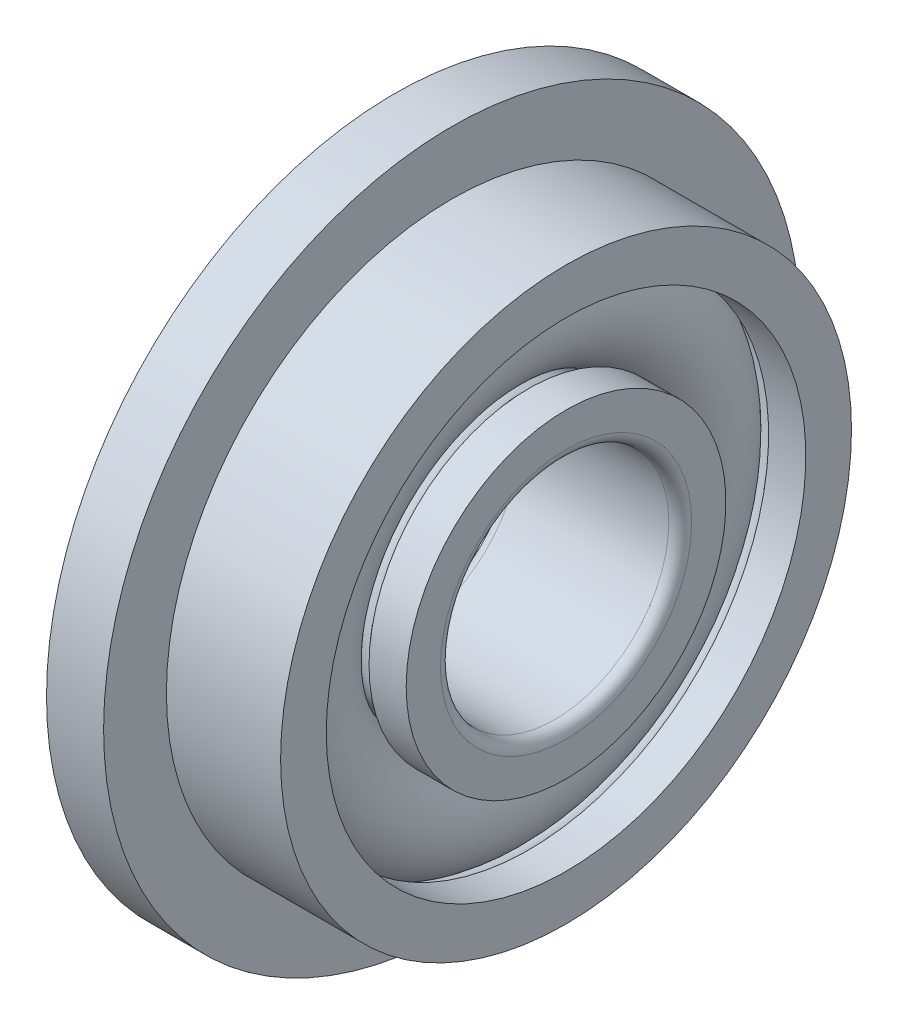
ISO-10303-21;
HEADER;
FILE_DESCRIPTION(('STEP AP214'),'2;1');
FILE_NAME('part.step','',(''),(''),'','','');
FILE_SCHEMA(('AUTOMOTIVE_DESIGN { 1 0 10303 214 1 1 1 1 }'));
ENDSEC;
DATA;
#1=APPLICATION_CONTEXT('core data for automotive mechanical design processes');
#2=APPLICATION_PROTOCOL_DEFINITION('international standard','automotive_design',2000,#1);
#3=PRODUCT_CONTEXT('',#1,'mechanical');
#4=PRODUCT('Part','Part','',(#3));
#5=PRODUCT_RELATED_PRODUCT_CATEGORY('part','',(#4));
#6=PRODUCT_DEFINITION_FORMATION('','',#4);
#7=PRODUCT_DEFINITION_CONTEXT('part definition',#1,'design');
#8=PRODUCT_DEFINITION('design','',#6,#7);
#9=PRODUCT_DEFINITION_SHAPE('','',#8);
#10=(LENGTH_UNIT() NAMED_UNIT(*) SI_UNIT(.MILLI.,.METRE.));
#11=(NAMED_UNIT(*) PLANE_ANGLE_UNIT() SI_UNIT($,.RADIAN.));
#12=(NAMED_UNIT(*) SI_UNIT($,.STERADIAN.) SOLID_ANGLE_UNIT());
#13=UNCERTAINTY_MEASURE_WITH_UNIT(LENGTH_MEASURE(1.E-05),#10,'distance_accuracy_value','');
#14=(GEOMETRIC_REPRESENTATION_CONTEXT(3) GLOBAL_UNCERTAINTY_ASSIGNED_CONTEXT((#13)) GLOBAL_UNIT_ASSIGNED_CONTEXT((#10,
#11,#12)) REPRESENTATION_CONTEXT('',''));
#15=CARTESIAN_POINT('',(0.,0.,0.));
#16=DIRECTION('',(0.,0.,1.));
#17=DIRECTION('',(1.,0.,0.));
#18=AXIS2_PLACEMENT_3D('',#15,#16,#17);
#19=CARTESIAN_POINT('',(0.75,0.,0.));
#20=DIRECTION('',(-1.,0.,0.));
#21=DIRECTION('',(0.,0.,1.));
#22=AXIS2_PLACEMENT_3D('',#19,#20,#21);
#23=TOROIDAL_SURFACE('',#22,1.75,0.5);
#24=CARTESIAN_POINT('',(0.75,0.,2.25));
#25=VERTEX_POINT('',#24);
#26=VERTEX_LOOP('',#25);
#27=FACE_BOUND('',#26,.T.);
#28=ADVANCED_FACE('F50',(#27),#23,.T.);
#29=CLOSED_SHELL('',(#28));
#30=MANIFOLD_SOLID_BREP('B2',#29);
#31=CARTESIAN_POINT('',(1.5,1.4,0.));
#32=DIRECTION('',(-1.,0.,0.));
#33=DIRECTION('',(0.,0.,1.));
#34=AXIS2_PLACEMENT_3D('',#31,#32,#33);
#35=PLANE('',#34);
#36=CARTESIAN_POINT('',(1.5,0.,0.));
#37=DIRECTION('',(-1.,0.,0.));
#38=DIRECTION('',(0.,0.,1.));
#39=AXIS2_PLACEMENT_3D('',#36,#37,#38);
#40=CIRCLE('',#39,1.1);
#41=CARTESIAN_POINT('',(1.5,0.,1.1));
#42=VERTEX_POINT('',#41);
#43=EDGE_CURVE('E85',#42,#42,#40,.T.);
#44=ORIENTED_EDGE('',*,*,#43,.T.);
#45=EDGE_LOOP('',(#44));
#46=FACE_BOUND('',#45,.T.);
#47=CARTESIAN_POINT('',(1.5,0.,0.));
#48=DIRECTION('',(-1.,0.,0.));
#49=DIRECTION('',(0.,0.,1.));
#50=AXIS2_PLACEMENT_3D('',#47,#48,#49);
#51=CIRCLE('',#50,1.4);
#52=CARTESIAN_POINT('',(1.5,0.,1.4));
#53=VERTEX_POINT('',#52);
#54=EDGE_CURVE('E90',#53,#53,#51,.T.);
#55=ORIENTED_EDGE('',*,*,#54,.F.);
#56=EDGE_LOOP('',(#55));
#57=FACE_BOUND('',#56,.T.);
#58=ADVANCED_FACE('F70',(#46,#57),#35,.F.);
#59=CARTESIAN_POINT('',(0.,0.,0.));
#60=DIRECTION('',(-1.,0.,0.));
#61=DIRECTION('',(0.,0.,1.));
#62=AXIS2_PLACEMENT_3D('',#59,#60,#61);
#63=CYLINDRICAL_SURFACE('',#62,1.4);
#64=CARTESIAN_POINT('',(1.17426406871193,0.,0.));
#65=DIRECTION('',(-1.,0.,0.));
#66=DIRECTION('',(0.,0.,1.));
#67=AXIS2_PLACEMENT_3D('',#64,#65,#66);
#68=CIRCLE('',#67,1.4);
#69=CARTESIAN_POINT('',(1.17426406871193,0.,1.4));
#70=VERTEX_POINT('',#69);
#71=EDGE_CURVE('E93',#70,#70,#68,.T.);
#72=ORIENTED_EDGE('',*,*,#71,.F.);
#73=EDGE_LOOP('',(#72));
#74=FACE_BOUND('',#73,.T.);
#75=ORIENTED_EDGE('',*,*,#54,.T.);
#76=EDGE_LOOP('',(#75));
#77=FACE_BOUND('',#76,.T.);
#78=ADVANCED_FACE('F114',(#74,#77),#63,.T.);
#79=CARTESIAN_POINT('',(0.75,0.,0.));
#80=DIRECTION('',(-1.,0.,0.));
#81=DIRECTION('',(0.,0.,1.));
#82=AXIS2_PLACEMENT_3D('',#79,#80,#81);
#83=TOROIDAL_SURFACE('',#82,1.75,0.55);
#84=CARTESIAN_POINT('',(0.325735931288072,0.,0.));
#85=DIRECTION('',(-1.,0.,0.));
#86=DIRECTION('',(0.,0.,1.));
#87=AXIS2_PLACEMENT_3D('',#84,#85,#86);
#88=CIRCLE('',#87,1.4);
#89=CARTESIAN_POINT('',(0.325735931288072,0.,1.4));
#90=VERTEX_POINT('',#89);
#91=EDGE_CURVE('E96',#90,#90,#88,.T.);
#92=ORIENTED_EDGE('',*,*,#91,.F.);
#93=EDGE_LOOP('',(#92));
#94=FACE_BOUND('',#93,.T.);
#95=ORIENTED_EDGE('',*,*,#71,.T.);
#96=EDGE_LOOP('',(#95));
#97=FACE_BOUND('',#96,.T.);
#98=ADVANCED_FACE('F108',(#94,#97),#83,.F.);
#99=CARTESIAN_POINT('',(0.,0.,0.));
#100=DIRECTION('',(-1.,0.,0.));
#101=DIRECTION('',(0.,0.,1.));
#102=AXIS2_PLACEMENT_3D('',#99,#100,#101);
#103=CYLINDRICAL_SURFACE('',#102,1.4);
#104=CARTESIAN_POINT('',(0.,0.,0.));
#105=DIRECTION('',(-1.,0.,0.));
#106=DIRECTION('',(0.,0.,1.));
#107=AXIS2_PLACEMENT_3D('',#104,#105,#106);
#108=CIRCLE('',#107,1.4);
#109=CARTESIAN_POINT('',(0.,0.,1.4));
#110=VERTEX_POINT('',#109);
#111=EDGE_CURVE('E99',#110,#110,#108,.T.);
#112=ORIENTED_EDGE('',*,*,#111,.F.);
#113=EDGE_LOOP('',(#112));
#114=FACE_BOUND('',#113,.T.);
#115=ORIENTED_EDGE('',*,*,#91,.T.);
#116=EDGE_LOOP('',(#115));
#117=FACE_BOUND('',#116,.T.);
#118=ADVANCED_FACE('F105',(#114,#117),#103,.T.);
#119=CARTESIAN_POINT('',(0.,1.4,0.));
#120=DIRECTION('',(1.,0.,0.));
#121=DIRECTION('',(0.,0.,-1.));
#122=AXIS2_PLACEMENT_3D('',#119,#120,#121);
#123=PLANE('',#122);
#124=CARTESIAN_POINT('',(0.,0.,0.));
#125=DIRECTION('',(1.,0.,0.));
#126=DIRECTION('',(0.,0.,-1.));
#127=AXIS2_PLACEMENT_3D('',#124,#125,#126);
#128=CIRCLE('',#127,1.1);
#129=CARTESIAN_POINT('',(0.,0.,-1.1));
#130=VERTEX_POINT('',#129);
#131=EDGE_CURVE('E49',#130,#130,#128,.T.);
#132=ORIENTED_EDGE('',*,*,#131,.T.);
#133=EDGE_LOOP('',(#132));
#134=FACE_BOUND('',#133,.T.);
#135=ORIENTED_EDGE('',*,*,#111,.T.);
#136=EDGE_LOOP('',(#135));
#137=FACE_BOUND('',#136,.T.);
#138=ADVANCED_FACE('F103',(#134,#137),#123,.F.);
#139=CARTESIAN_POINT('',(0.,0.,0.));
#140=DIRECTION('',(-1.,0.,0.));
#141=DIRECTION('',(0.,0.,1.));
#142=AXIS2_PLACEMENT_3D('',#139,#140,#141);
#143=CYLINDRICAL_SURFACE('',#142,1.);
#144=CARTESIAN_POINT('',(1.4,0.,0.));
#145=DIRECTION('',(-1.,0.,0.));
#146=DIRECTION('',(0.,0.,1.));
#147=AXIS2_PLACEMENT_3D('',#144,#145,#146);
#148=CIRCLE('',#147,1.);
#149=CARTESIAN_POINT('',(1.4,0.,1.));
#150=VERTEX_POINT('',#149);
#151=EDGE_CURVE('E77',#150,#150,#148,.F.);
#152=ORIENTED_EDGE('',*,*,#151,.T.);
#153=EDGE_LOOP('',(#152));
#154=FACE_BOUND('',#153,.T.);
#155=CARTESIAN_POINT('',(0.1,0.,0.));
#156=DIRECTION('',(1.,0.,0.));
#157=DIRECTION('',(0.,0.,-1.));
#158=AXIS2_PLACEMENT_3D('',#155,#156,#157);
#159=CIRCLE('',#158,1.);
#160=CARTESIAN_POINT('',(0.1,0.,-1.));
#161=VERTEX_POINT('',#160);
#162=EDGE_CURVE('E81',#161,#161,#159,.F.);
#163=ORIENTED_EDGE('',*,*,#162,.T.);
#164=EDGE_LOOP('',(#163));
#165=FACE_BOUND('',#164,.T.);
#166=ADVANCED_FACE('F131',(#154,#165),#143,.F.);
#167=CARTESIAN_POINT('',(1.4,0.,0.));
#168=DIRECTION('',(-1.,0.,0.));
#169=DIRECTION('',(0.,0.,1.));
#170=AXIS2_PLACEMENT_3D('',#167,#168,#169);
#171=TOROIDAL_SURFACE('',#170,1.1,0.1);
#172=ORIENTED_EDGE('',*,*,#151,.F.);
#173=EDGE_LOOP('',(#172));
#174=FACE_BOUND('',#173,.T.);
#175=ORIENTED_EDGE('',*,*,#43,.F.);
#176=EDGE_LOOP('',(#175));
#177=FACE_BOUND('',#176,.T.);
#178=ADVANCED_FACE('F129',(#174,#177),#171,.T.);
#179=CARTESIAN_POINT('',(0.1,0.,0.));
#180=DIRECTION('',(1.,0.,0.));
#181=DIRECTION('',(0.,0.,-1.));
#182=AXIS2_PLACEMENT_3D('',#179,#180,#181);
#183=TOROIDAL_SURFACE('',#182,1.1,0.1);
#184=ORIENTED_EDGE('',*,*,#131,.F.);
#185=EDGE_LOOP('',(#184));
#186=FACE_BOUND('',#185,.T.);
#187=ORIENTED_EDGE('',*,*,#162,.F.);
#188=EDGE_LOOP('',(#187));
#189=FACE_BOUND('',#188,.T.);
#190=ADVANCED_FACE('F72',(#186,#189),#183,.T.);
#191=CLOSED_SHELL('',(#58,#78,#98,#118,#138,#166,#178,#190));
#192=MANIFOLD_SOLID_BREP('B6',#191);
#193=CARTESIAN_POINT('',(0.,2.5,0.));
#194=DIRECTION('',(1.,0.,0.));
#195=DIRECTION('',(0.,0.,-1.));
#196=AXIS2_PLACEMENT_3D('',#193,#194,#195);
#197=PLANE('',#196);
#198=CARTESIAN_POINT('',(0.,0.,0.));
#199=DIRECTION('',(-1.,0.,0.));
#200=DIRECTION('',(0.,0.,1.));
#201=AXIS2_PLACEMENT_3D('',#198,#199,#200);
#202=CIRCLE('',#201,2.1);
#203=CARTESIAN_POINT('',(0.,0.,2.1));
#204=VERTEX_POINT('',#203);
#205=EDGE_CURVE('E69',#204,#204,#202,.T.);
#206=ORIENTED_EDGE('',*,*,#205,.F.);
#207=EDGE_LOOP('',(#206));
#208=FACE_BOUND('',#207,.T.);
#209=CARTESIAN_POINT('',(0.,0.,0.));
#210=DIRECTION('',(-1.,0.,0.));
#211=DIRECTION('',(0.,0.,1.));
#212=AXIS2_PLACEMENT_3D('',#209,#210,#211);
#213=CIRCLE('',#212,3.05);
#214=CARTESIAN_POINT('',(0.,0.,3.05));
#215=VERTEX_POINT('',#214);
#216=EDGE_CURVE('E227',#215,#215,#213,.T.);
#217=ORIENTED_EDGE('',*,*,#216,.T.);
#218=EDGE_LOOP('',(#217));
#219=FACE_BOUND('',#218,.T.);
#220=ADVANCED_FACE('F192',(#208,#219),#197,.F.);
#221=CARTESIAN_POINT('',(0.,0.,0.));
#222=DIRECTION('',(-1.,0.,0.));
#223=DIRECTION('',(0.,0.,1.));
#224=AXIS2_PLACEMENT_3D('',#221,#222,#223);
#225=CYLINDRICAL_SURFACE('',#224,2.1);
#226=CARTESIAN_POINT('',(0.325735931288072,0.,0.));
#227=DIRECTION('',(-1.,0.,0.));
#228=DIRECTION('',(0.,0.,1.));
#229=AXIS2_PLACEMENT_3D('',#226,#227,#228);
#230=CIRCLE('',#229,2.1);
#231=CARTESIAN_POINT('',(0.325735931288072,0.,2.1));
#232=VERTEX_POINT('',#231);
#233=EDGE_CURVE('E199',#232,#232,#230,.T.);
#234=ORIENTED_EDGE('',*,*,#233,.F.);
#235=EDGE_LOOP('',(#234));
#236=FACE_BOUND('',#235,.T.);
#237=ORIENTED_EDGE('',*,*,#205,.T.);
#238=EDGE_LOOP('',(#237));
#239=FACE_BOUND('',#238,.T.);
#240=ADVANCED_FACE('F265',(#236,#239),#225,.F.);
#241=CARTESIAN_POINT('',(0.75,0.,0.));
#242=DIRECTION('',(-1.,0.,0.));
#243=DIRECTION('',(0.,0.,1.));
#244=AXIS2_PLACEMENT_3D('',#241,#242,#243);
#245=TOROIDAL_SURFACE('',#244,1.75,0.55);
#246=CARTESIAN_POINT('',(1.17426406871193,0.,0.));
#247=DIRECTION('',(-1.,0.,0.));
#248=DIRECTION('',(0.,0.,1.));
#249=AXIS2_PLACEMENT_3D('',#246,#247,#248);
#250=CIRCLE('',#249,2.1);
#251=CARTESIAN_POINT('',(1.17426406871193,0.,2.1));
#252=VERTEX_POINT('',#251);
#253=EDGE_CURVE('E204',#252,#252,#250,.T.);
#254=ORIENTED_EDGE('',*,*,#253,.F.);
#255=EDGE_LOOP('',(#254));
#256=FACE_BOUND('',#255,.T.);
#257=ORIENTED_EDGE('',*,*,#233,.T.);
#258=EDGE_LOOP('',(#257));
#259=FACE_BOUND('',#258,.T.);
#260=ADVANCED_FACE('F260',(#256,#259),#245,.F.);
#261=CARTESIAN_POINT('',(0.,0.,0.));
#262=DIRECTION('',(-1.,0.,0.));
#263=DIRECTION('',(0.,0.,1.));
#264=AXIS2_PLACEMENT_3D('',#261,#262,#263);
#265=CYLINDRICAL_SURFACE('',#264,2.1);
#266=CARTESIAN_POINT('',(1.5,0.,0.));
#267=DIRECTION('',(-1.,0.,0.));
#268=DIRECTION('',(0.,0.,1.));
#269=AXIS2_PLACEMENT_3D('',#266,#267,#268);
#270=CIRCLE('',#269,2.1);
#271=CARTESIAN_POINT('',(1.5,0.,2.1));
#272=VERTEX_POINT('',#271);
#273=EDGE_CURVE('E209',#272,#272,#270,.T.);
#274=ORIENTED_EDGE('',*,*,#273,.F.);
#275=EDGE_LOOP('',(#274));
#276=FACE_BOUND('',#275,.T.);
#277=ORIENTED_EDGE('',*,*,#253,.T.);
#278=EDGE_LOOP('',(#277));
#279=FACE_BOUND('',#278,.T.);
#280=ADVANCED_FACE('F254',(#276,#279),#265,.F.);
#281=CARTESIAN_POINT('',(1.5,2.5,0.));
#282=DIRECTION('',(-1.,0.,0.));
#283=DIRECTION('',(0.,0.,1.));
#284=AXIS2_PLACEMENT_3D('',#281,#282,#283);
#285=PLANE('',#284);
#286=CARTESIAN_POINT('',(1.5,0.,0.));
#287=DIRECTION('',(-1.,0.,0.));
#288=DIRECTION('',(0.,0.,1.));
#289=AXIS2_PLACEMENT_3D('',#286,#287,#288);
#290=CIRCLE('',#289,2.5);
#291=CARTESIAN_POINT('',(1.5,0.,2.5));
#292=VERTEX_POINT('',#291);
#293=EDGE_CURVE('E215',#292,#292,#290,.T.);
#294=ORIENTED_EDGE('',*,*,#293,.F.);
#295=EDGE_LOOP('',(#294));
#296=FACE_BOUND('',#295,.T.);
#297=ORIENTED_EDGE('',*,*,#273,.T.);
#298=EDGE_LOOP('',(#297));
#299=FACE_BOUND('',#298,.T.);
#300=ADVANCED_FACE('F248',(#296,#299),#285,.F.);
#301=CARTESIAN_POINT('',(0.,0.,0.));
#302=DIRECTION('',(-1.,0.,0.));
#303=DIRECTION('',(0.,0.,1.));
#304=AXIS2_PLACEMENT_3D('',#301,#302,#303);
#305=CYLINDRICAL_SURFACE('',#304,2.5);
#306=CARTESIAN_POINT('',(0.5,0.,0.));
#307=DIRECTION('',(-1.,0.,0.));
#308=DIRECTION('',(0.,0.,1.));
#309=AXIS2_PLACEMENT_3D('',#306,#307,#308);
#310=CIRCLE('',#309,2.5);
#311=CARTESIAN_POINT('',(0.5,0.,2.5));
#312=VERTEX_POINT('',#311);
#313=EDGE_CURVE('E219',#312,#312,#310,.T.);
#314=ORIENTED_EDGE('',*,*,#313,.F.);
#315=EDGE_LOOP('',(#314));
#316=FACE_BOUND('',#315,.T.);
#317=ORIENTED_EDGE('',*,*,#293,.T.);
#318=EDGE_LOOP('',(#317));
#319=FACE_BOUND('',#318,.T.);
#320=ADVANCED_FACE('F242',(#316,#319),#305,.T.);
#321=CARTESIAN_POINT('',(0.5,3.05,0.));
#322=DIRECTION('',(-1.,0.,0.));
#323=DIRECTION('',(0.,0.,1.));
#324=AXIS2_PLACEMENT_3D('',#321,#322,#323);
#325=PLANE('',#324);
#326=CARTESIAN_POINT('',(0.5,0.,0.));
#327=DIRECTION('',(-1.,0.,0.));
#328=DIRECTION('',(0.,0.,1.));
#329=AXIS2_PLACEMENT_3D('',#326,#327,#328);
#330=CIRCLE('',#329,3.05);
#331=CARTESIAN_POINT('',(0.5,0.,3.05));
#332=VERTEX_POINT('',#331);
#333=EDGE_CURVE('E223',#332,#332,#330,.T.);
#334=ORIENTED_EDGE('',*,*,#333,.F.);
#335=EDGE_LOOP('',(#334));
#336=FACE_BOUND('',#335,.T.);
#337=ORIENTED_EDGE('',*,*,#313,.T.);
#338=EDGE_LOOP('',(#337));
#339=FACE_BOUND('',#338,.T.);
#340=ADVANCED_FACE('F236',(#336,#339),#325,.F.);
#341=CARTESIAN_POINT('',(0.,0.,0.));
#342=DIRECTION('',(-1.,0.,0.));
#343=DIRECTION('',(0.,0.,1.));
#344=AXIS2_PLACEMENT_3D('',#341,#342,#343);
#345=CYLINDRICAL_SURFACE('',#344,3.05);
#346=ORIENTED_EDGE('',*,*,#216,.F.);
#347=EDGE_LOOP('',(#346));
#348=FACE_BOUND('',#347,.T.);
#349=ORIENTED_EDGE('',*,*,#333,.T.);
#350=EDGE_LOOP('',(#349));
#351=FACE_BOUND('',#350,.T.);
#352=ADVANCED_FACE('F233',(#348,#351),#345,.T.);
#353=CLOSED_SHELL('',(#220,#240,#260,#280,#300,#320,#340,#352));
#354=MANIFOLD_SOLID_BREP('B44',#353);
#355=ADVANCED_BREP_SHAPE_REPRESENTATION('',(#18,#30,#192,#354),#14);
#356=SHAPE_DEFINITION_REPRESENTATION(#9,#355);
ENDSEC;
END-ISO-10303-21;
